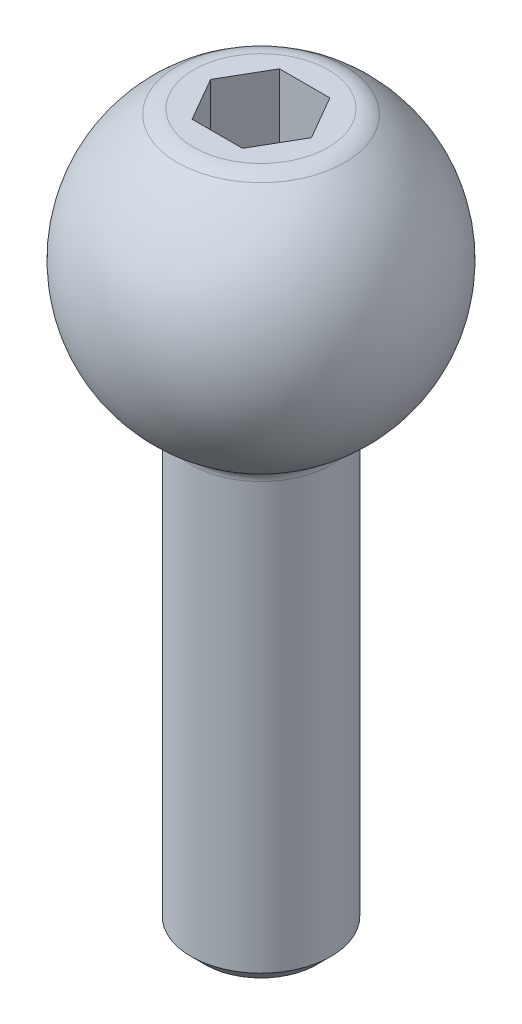
ISO-10303-21;
HEADER;
FILE_DESCRIPTION(('STEP AP214'),'2;1');
FILE_NAME('part.step','',(''),(''),'','','');
FILE_SCHEMA(('AUTOMOTIVE_DESIGN { 1 0 10303 214 1 1 1 1 }'));
ENDSEC;
DATA;
#1=APPLICATION_CONTEXT('core data for automotive mechanical design processes');
#2=APPLICATION_PROTOCOL_DEFINITION('international standard','automotive_design',2000,#1);
#3=PRODUCT_CONTEXT('',#1,'mechanical');
#4=PRODUCT('Part','Part','',(#3));
#5=PRODUCT_RELATED_PRODUCT_CATEGORY('part','',(#4));
#6=PRODUCT_DEFINITION_FORMATION('','',#4);
#7=PRODUCT_DEFINITION_CONTEXT('part definition',#1,'design');
#8=PRODUCT_DEFINITION('design','',#6,#7);
#9=PRODUCT_DEFINITION_SHAPE('','',#8);
#10=(LENGTH_UNIT() NAMED_UNIT(*) SI_UNIT(.MILLI.,.METRE.));
#11=(NAMED_UNIT(*) PLANE_ANGLE_UNIT() SI_UNIT($,.RADIAN.));
#12=(NAMED_UNIT(*) SI_UNIT($,.STERADIAN.) SOLID_ANGLE_UNIT());
#13=UNCERTAINTY_MEASURE_WITH_UNIT(LENGTH_MEASURE(1.E-05),#10,'distance_accuracy_value','');
#14=(GEOMETRIC_REPRESENTATION_CONTEXT(3) GLOBAL_UNCERTAINTY_ASSIGNED_CONTEXT((#13)) GLOBAL_UNIT_ASSIGNED_CONTEXT((#10,
#11,#12)) REPRESENTATION_CONTEXT('',''));
#15=CARTESIAN_POINT('',(0.,0.,0.));
#16=DIRECTION('',(0.,0.,1.));
#17=DIRECTION('',(1.,0.,0.));
#18=AXIS2_PLACEMENT_3D('',#15,#16,#17);
#19=CARTESIAN_POINT('',(0.,0.,0.));
#20=DIRECTION('',(0.,-1.,0.));
#21=DIRECTION('',(-1.,0.,0.));
#22=AXIS2_PLACEMENT_3D('',#19,#20,#21);
#23=SPHERICAL_SURFACE('',#22,4.1275);
#24=CARTESIAN_POINT('',(0.,3.43892318999651,0.));
#25=DIRECTION('',(0.,-1.,0.));
#26=DIRECTION('',(0.,0.,-1.));
#27=AXIS2_PLACEMENT_3D('',#24,#25,#26);
#28=CIRCLE('',#27,2.28255636147375);
#29=CARTESIAN_POINT('',(-2.28255636147374,3.43892318999651,0.));
#30=VERTEX_POINT('',#29);
#31=EDGE_CURVE('E12',#30,#30,#28,.T.);
#32=CARTESIAN_POINT('',(0.,-3.55757974853397,0.));
#33=DIRECTION('',(0.,1.,0.));
#34=DIRECTION('',(-1.,0.,0.));
#35=AXIS2_PLACEMENT_3D('',#32,#33,#34);
#36=CIRCLE('',#35,2.09281690140848);
#37=CARTESIAN_POINT('',(-2.09281690140847,-3.55757974853397,0.));
#38=VERTEX_POINT('',#37);
#39=EDGE_CURVE('E153',#38,#38,#36,.T.);
#40=CARTESIAN_POINT('',(-2.28255636147374,3.43892318999651,0.));
#41=CARTESIAN_POINT('',(-2.35505798357408,3.39080558247677,0.));
#42=CARTESIAN_POINT('',(-2.4260332394035,3.34038911810698,0.));
#43=CARTESIAN_POINT('',(-2.56465769851458,3.23517389673687,0.));
#44=CARTESIAN_POINT('',(-2.63230690179625,3.18037513973656,0.));
#45=CARTESIAN_POINT('',(-2.7640059358059,3.06661075417502,0.));
#46=CARTESIAN_POINT('',(-2.82805576653389,3.00764512561378,0.));
#47=CARTESIAN_POINT('',(-2.95230069197059,2.88578377551208,0.));
#48=CARTESIAN_POINT('',(-3.01249578667929,2.82288805397161,0.));
#49=CARTESIAN_POINT('',(-3.12879033568443,2.6934177536557,0.));
#50=CARTESIAN_POINT('',(-3.18488978998085,2.62684317488026,0.));
#51=CARTESIAN_POINT('',(-3.29276878690032,2.49028144362942,0.));
#52=CARTESIAN_POINT('',(-3.34454832952335,2.42029429115402,0.));
#53=CARTESIAN_POINT('',(-3.4435804373418,2.27718725159393,0.));
#54=CARTESIAN_POINT('',(-3.49083300253722,2.20406736450925,0.));
#55=CARTESIAN_POINT('',(-3.58062221017666,2.05498724591567,0.));
#56=CARTESIAN_POINT('',(-3.6231588526207,1.97902701440679,0.));
#57=CARTESIAN_POINT('',(-3.70334612210896,1.82456994837222,0.));
#58=CARTESIAN_POINT('',(-3.74099674915318,1.74607311384653,0.));
#59=CARTESIAN_POINT('',(-3.8112614342607,1.58685672805804,0.));
#60=CARTESIAN_POINT('',(-3.84387549232399,1.50613717679523,0.));
#61=CARTESIAN_POINT('',(-3.90393662530327,1.34279813134152,0.));
#62=CARTESIAN_POINT('',(-3.93138370021926,1.26017863715062,0.));
#63=CARTESIAN_POINT('',(-3.98100111408863,1.0933700770913,0.));
#64=CARTESIAN_POINT('',(-4.00317145304201,1.0091810112229,0.));
#65=CARTESIAN_POINT('',(-4.04214674227123,0.839569955284405,0.));
#66=CARTESIAN_POINT('',(-4.05895169254708,0.754147965214321,0.));
#67=CARTESIAN_POINT('',(-4.08712900633524,0.582412638461008,0.));
#68=CARTESIAN_POINT('',(-4.09850136984755,0.496099301777781,0.));
#69=CARTESIAN_POINT('',(-4.1157680353484,0.32292642361906,0.));
#70=CARTESIAN_POINT('',(-4.12166233733695,0.236066882143567,0.));
#71=CARTESIAN_POINT('',(-4.12794931019846,0.0621489203352528,0.));
#72=CARTESIAN_POINT('',(-4.12834198107142,-0.0249094999975685,0.));
#73=CARTESIAN_POINT('',(-4.1236241215256,-0.198877098327304,0.));
#74=CARTESIAN_POINT('',(-4.11851359110681,-0.285786276324219,0.));
#75=CARTESIAN_POINT('',(-4.10280976449589,-0.459107865565415,0.));
#76=CARTESIAN_POINT('',(-4.09221646830376,-0.545520276809696,0.));
#77=CARTESIAN_POINT('',(-4.06558946964324,-0.717502794553873,0.));
#78=CARTESIAN_POINT('',(-4.04955576717485,-0.803072901053768,0.));
#79=CARTESIAN_POINT('',(-4.01211207005491,-0.97302863944872,0.));
#80=CARTESIAN_POINT('',(-3.99070207540336,-1.05741427134378,0.));
#81=CARTESIAN_POINT('',(-3.94259140623056,-1.22466362703407,0.));
#82=CARTESIAN_POINT('',(-3.91589073170931,-1.3075273508293,0.));
#83=CARTESIAN_POINT('',(-3.85730547100025,-1.47140154250022,0.));
#84=CARTESIAN_POINT('',(-3.82542088481244,-1.5524120103759,0.));
#85=CARTESIAN_POINT('',(-3.75659529789844,-1.71225575298232,0.));
#86=CARTESIAN_POINT('',(-3.71965429717224,-1.79108902771305,0.));
#87=CARTESIAN_POINT('',(-3.64086359752218,-1.94626315289333,0.));
#88=CARTESIAN_POINT('',(-3.59901389859832,-2.02260400334286,0.));
#89=CARTESIAN_POINT('',(-3.51057314701628,-2.17248801481706,0.));
#90=CARTESIAN_POINT('',(-3.46398209435811,-2.24603117584171,0.));
#91=CARTESIAN_POINT('',(-3.36624494028222,-2.39002573227195,0.));
#92=CARTESIAN_POINT('',(-3.31509883886451,-2.46047712767753,0.));
#93=CARTESIAN_POINT('',(-3.20845610199029,-2.5980064330004,0.));
#94=CARTESIAN_POINT('',(-3.15295946653378,-2.6650843429177,0.));
#95=CARTESIAN_POINT('',(-3.03783758984878,-2.7955984721417,0.));
#96=CARTESIAN_POINT('',(-2.9782123486203,-2.85903469144842,0.));
#97=CARTESIAN_POINT('',(-2.85507163418516,-2.98201170247325,0.));
#98=CARTESIAN_POINT('',(-2.7915561609785,-3.04155249419137,0.));
#99=CARTESIAN_POINT('',(-2.66088914949714,-3.15650084022519,0.));
#100=CARTESIAN_POINT('',(-2.59373761122244,-3.21190839454089,0.));
#101=CARTESIAN_POINT('',(-2.45606629077885,-3.31836767552939,0.));
#102=CARTESIAN_POINT('',(-2.38554650860995,-3.3694194022022,0.));
#103=CARTESIAN_POINT('',(-2.24142329415391,-3.46696673700259,0.));
#104=CARTESIAN_POINT('',(-2.16781986186677,-3.51346234513017,0.));
#105=CARTESIAN_POINT('',(-2.09281690140847,-3.55757974853397,0.));
#106=B_SPLINE_CURVE_WITH_KNOTS('',3,(#40,#41,#42,#43,#44,#45,#46,#47,#48,#49,#50,#51,#52,#53,
#54,#55,#56,#57,#58,#59,#60,#61,#62,#63,#64,#65,#66,#67,#68,#69,#70,#71,#72,#73,#74,#75,#76,#77,
#78,#79,#80,#81,#82,#83,#84,#85,#86,#87,#88,#89,#90,#91,#92,#93,#94,#95,#96,#97,#98,#99,#100,
#101,#102,#103,#104,#105),.UNSPECIFIED.,.F.,.F.,(4,2,2,2,2,2,2,2,2,2,2,2,2,2,2,2,2,2,2,2,2,2,2,
2,2,2,2,2,2,2,2,2,4),(0.,0.261003855289274,0.522007710578546,0.78301156586782,1.04401542115709,
1.30501927644637,1.56602313173564,1.82702698702491,2.08803084231419,2.34903469760346,
2.61003855289273,2.87104240818201,3.13204626347128,3.39305011876056,3.65405397404983,
3.9150578293391,4.17606168462838,4.43706553991765,4.69806939520692,4.9590732504962,
5.22007710578547,5.48108096107474,5.74208481636402,6.00308867165329,6.26409252694256,
6.52509638223184,6.78610023752111,7.04710409281038,7.30810794809966,7.56911180338893,
7.83011565867821,8.09111951396748,8.35212336925675),.UNSPECIFIED.);
#107=EDGE_CURVE('BSEAM43',#30,#38,#106,.T.);
#108=ORIENTED_EDGE('',*,*,#31,.T.);
#109=ORIENTED_EDGE('',*,*,#39,.T.);
#110=ORIENTED_EDGE('',*,*,#107,.T.);
#111=ORIENTED_EDGE('',*,*,#107,.F.);
#112=EDGE_LOOP('',(#108,#110,#109,#111));
#113=FACE_BOUND('',#112,.T.);
#114=ADVANCED_FACE('F43',(#113),#23,.T.);
#115=CARTESIAN_POINT('',(3.4828776957276E-13,-101.534252961197,0.));
#116=DIRECTION('',(0.,-1.,0.));
#117=DIRECTION('',(1.,0.,0.));
#118=AXIS2_PLACEMENT_3D('',#115,#116,#117);
#119=CYLINDRICAL_SURFACE('',#118,1.90500000000003);
#120=CARTESIAN_POINT('',(0.,-15.494,0.));
#121=DIRECTION('',(0.,1.,0.));
#122=DIRECTION('',(-1.,0.,0.));
#123=AXIS2_PLACEMENT_3D('',#120,#121,#122);
#124=CIRCLE('',#123,1.90500000000003);
#125=CARTESIAN_POINT('',(-1.90499999999998,-15.494,0.));
#126=VERTEX_POINT('',#125);
#127=EDGE_CURVE('E159',#126,#126,#124,.T.);
#128=ORIENTED_EDGE('',*,*,#127,.T.);
#129=EDGE_LOOP('',(#128));
#130=FACE_BOUND('',#129,.T.);
#131=CARTESIAN_POINT('',(0.,-3.88597172532171,0.));
#132=DIRECTION('',(0.,1.,0.));
#133=DIRECTION('',(-1.,0.,0.));
#134=AXIS2_PLACEMENT_3D('',#131,#132,#133);
#135=CIRCLE('',#134,1.90500000000003);
#136=CARTESIAN_POINT('',(-1.90500000000002,-3.88597172532171,0.));
#137=VERTEX_POINT('',#136);
#138=EDGE_CURVE('E145',#137,#137,#135,.F.);
#139=ORIENTED_EDGE('',*,*,#138,.T.);
#140=EDGE_LOOP('',(#139));
#141=FACE_BOUND('',#140,.T.);
#142=ADVANCED_FACE('F180',(#130,#141),#119,.T.);
#143=CARTESIAN_POINT('',(-1.905,-15.875,0.));
#144=DIRECTION('',(0.,1.,0.));
#145=DIRECTION('',(-1.,0.,0.));
#146=AXIS2_PLACEMENT_3D('',#143,#144,#145);
#147=PLANE('',#146);
#148=CARTESIAN_POINT('',(0.,-15.875,0.));
#149=DIRECTION('',(0.,1.,0.));
#150=DIRECTION('',(-1.,0.,0.));
#151=AXIS2_PLACEMENT_3D('',#148,#149,#150);
#152=CIRCLE('',#151,1.52400000000007);
#153=CARTESIAN_POINT('',(-1.52400000000001,-15.875,0.));
#154=VERTEX_POINT('',#153);
#155=EDGE_CURVE('E156',#154,#154,#152,.F.);
#156=ORIENTED_EDGE('',*,*,#155,.T.);
#157=EDGE_LOOP('',(#156));
#158=FACE_BOUND('',#157,.T.);
#159=ADVANCED_FACE('F186',(#158),#147,.F.);
#160=CARTESIAN_POINT('',(0.,-3.88597172532172,0.));
#161=DIRECTION('',(0.,1.,0.));
#162=DIRECTION('',(-1.,0.,0.));
#163=AXIS2_PLACEMENT_3D('',#160,#161,#162);
#164=TOROIDAL_SURFACE('',#163,2.28600000000003,0.381);
#165=ORIENTED_EDGE('',*,*,#39,.F.);
#166=EDGE_LOOP('',(#165));
#167=FACE_BOUND('',#166,.T.);
#168=ORIENTED_EDGE('',*,*,#138,.F.);
#169=EDGE_LOOP('',(#168));
#170=FACE_BOUND('',#169,.T.);
#171=ADVANCED_FACE('F192',(#167,#170),#164,.F.);
#172=CARTESIAN_POINT('',(0.,-15.875,0.));
#173=DIRECTION('',(0.,1.,0.));
#174=DIRECTION('',(-1.,0.,0.));
#175=AXIS2_PLACEMENT_3D('',#172,#173,#174);
#176=CONICAL_SURFACE('',#175,1.52400000000007,0.785398163397452);
#177=ORIENTED_EDGE('',*,*,#127,.F.);
#178=EDGE_LOOP('',(#177));
#179=FACE_BOUND('',#178,.T.);
#180=ORIENTED_EDGE('',*,*,#155,.F.);
#181=EDGE_LOOP('',(#180));
#182=FACE_BOUND('',#181,.T.);
#183=ADVANCED_FACE('F175',(#179,#182),#176,.T.);
#184=CARTESIAN_POINT('',(0.,3.57451985412027,0.));
#185=DIRECTION('',(0.,1.,0.));
#186=DIRECTION('',(0.,0.,1.));
#187=AXIS2_PLACEMENT_3D('',#184,#185,#186);
#188=PLANE('',#187);
#189=DIRECTION('',(0.5,0.,0.866025403784439));
#190=VECTOR('',#189,1.);
#191=CARTESIAN_POINT('',(-1.3748153285078,3.57451985412027,0.));
#192=LINE('',#191,#190);
#193=CARTESIAN_POINT('',(-1.3748153285078,3.57451985412027,0.));
#194=VERTEX_POINT('',#193);
#195=CARTESIAN_POINT('',(-0.687407664253897,3.57451985412027,1.190625));
#196=VERTEX_POINT('',#195);
#197=EDGE_CURVE('E58',#194,#196,#192,.T.);
#198=ORIENTED_EDGE('',*,*,#197,.F.);
#199=DIRECTION('',(-0.5,0.,0.866025403784438));
#200=VECTOR('',#199,1.);
#201=CARTESIAN_POINT('',(-0.687407664253897,3.57451985412027,-1.190625));
#202=LINE('',#201,#200);
#203=CARTESIAN_POINT('',(-0.687407664253897,3.57451985412027,-1.190625));
#204=VERTEX_POINT('',#203);
#205=EDGE_CURVE('E141',#204,#194,#202,.T.);
#206=ORIENTED_EDGE('',*,*,#205,.F.);
#207=DIRECTION('',(-1.,0.,0.));
#208=VECTOR('',#207,1.);
#209=CARTESIAN_POINT('',(0.687407664253899,3.57451985412027,-1.190625));
#210=LINE('',#209,#208);
#211=CARTESIAN_POINT('',(0.687407664253899,3.57451985412027,-1.190625));
#212=VERTEX_POINT('',#211);
#213=EDGE_CURVE('E139',#212,#204,#210,.T.);
#214=ORIENTED_EDGE('',*,*,#213,.F.);
#215=DIRECTION('',(-0.5,0.,-0.866025403784438));
#216=VECTOR('',#215,1.);
#217=CARTESIAN_POINT('',(1.3748153285078,3.57451985412027,0.));
#218=LINE('',#217,#216);
#219=CARTESIAN_POINT('',(1.3748153285078,3.57451985412027,0.));
#220=VERTEX_POINT('',#219);
#221=EDGE_CURVE('E106',#220,#212,#218,.T.);
#222=ORIENTED_EDGE('',*,*,#221,.F.);
#223=DIRECTION('',(0.5,0.,-0.866025403784439));
#224=VECTOR('',#223,1.);
#225=CARTESIAN_POINT('',(0.687407664253899,3.57451985412027,1.190625));
#226=LINE('',#225,#224);
#227=CARTESIAN_POINT('',(0.687407664253899,3.57451985412027,1.190625));
#228=VERTEX_POINT('',#227);
#229=EDGE_CURVE('E135',#228,#220,#226,.T.);
#230=ORIENTED_EDGE('',*,*,#229,.F.);
#231=DIRECTION('',(1.,0.,0.));
#232=VECTOR('',#231,1.);
#233=CARTESIAN_POINT('',(-0.687407664253897,3.57451985412027,1.190625));
#234=LINE('',#233,#232);
#235=EDGE_CURVE('E132',#196,#228,#234,.T.);
#236=ORIENTED_EDGE('',*,*,#235,.F.);
#237=EDGE_LOOP('',(#198,#206,#214,#222,#230,#236));
#238=FACE_BOUND('',#237,.T.);
#239=CARTESIAN_POINT('',(0.,3.57451985412027,0.));
#240=DIRECTION('',(0.,1.,0.));
#241=DIRECTION('',(0.,0.,1.));
#242=AXIS2_PLACEMENT_3D('',#239,#240,#241);
#243=CIRCLE('',#242,1.83306833952199);
#244=CARTESIAN_POINT('',(0.,3.57451985412027,1.83306833952199));
#245=VERTEX_POINT('',#244);
#246=EDGE_CURVE('E51',#245,#245,#243,.T.);
#247=ORIENTED_EDGE('',*,*,#246,.T.);
#248=EDGE_LOOP('',(#247));
#249=FACE_BOUND('',#248,.T.);
#250=ADVANCED_FACE('F164',(#238,#249),#188,.T.);
#251=CARTESIAN_POINT('',(0.,2.76171985412027,0.));
#252=DIRECTION('',(0.,1.,0.));
#253=DIRECTION('',(0.,0.,1.));
#254=AXIS2_PLACEMENT_3D('',#251,#252,#253);
#255=TOROIDAL_SURFACE('',#254,1.83306833952199,0.8128);
#256=ORIENTED_EDGE('',*,*,#31,.F.);
#257=EDGE_LOOP('',(#256));
#258=FACE_BOUND('',#257,.T.);
#259=ORIENTED_EDGE('',*,*,#246,.F.);
#260=EDGE_LOOP('',(#259));
#261=FACE_BOUND('',#260,.T.);
#262=ADVANCED_FACE('F45',(#258,#261),#255,.T.);
#263=CARTESIAN_POINT('',(-1.3748153285078,1.03451985412027,0.));
#264=DIRECTION('',(-0.866025403784439,0.,0.5));
#265=DIRECTION('',(0.5,0.,0.866025403784439));
#266=AXIS2_PLACEMENT_3D('',#263,#264,#265);
#267=PLANE('',#266);
#268=ORIENTED_EDGE('',*,*,#197,.T.);
#269=DIRECTION('',(0.,1.,0.));
#270=VECTOR('',#269,1.);
#271=CARTESIAN_POINT('',(-0.687407664253897,1.03451985412027,1.190625));
#272=LINE('',#271,#270);
#273=CARTESIAN_POINT('',(-0.687407664253897,1.03451985412027,1.190625));
#274=VERTEX_POINT('',#273);
#275=EDGE_CURVE('E88',#274,#196,#272,.T.);
#276=ORIENTED_EDGE('',*,*,#275,.F.);
#277=DIRECTION('',(0.5,0.,0.866025403784439));
#278=VECTOR('',#277,1.);
#279=CARTESIAN_POINT('',(-1.3748153285078,1.03451985412027,0.));
#280=LINE('',#279,#278);
#281=CARTESIAN_POINT('',(-1.3748153285078,1.03451985412027,0.));
#282=VERTEX_POINT('',#281);
#283=EDGE_CURVE('E143',#282,#274,#280,.T.);
#284=ORIENTED_EDGE('',*,*,#283,.F.);
#285=DIRECTION('',(0.,1.,0.));
#286=VECTOR('',#285,1.);
#287=CARTESIAN_POINT('',(-1.3748153285078,1.03451985412027,0.));
#288=LINE('',#287,#286);
#289=EDGE_CURVE('E66',#282,#194,#288,.T.);
#290=ORIENTED_EDGE('',*,*,#289,.T.);
#291=EDGE_LOOP('',(#268,#276,#284,#290));
#292=FACE_BOUND('',#291,.T.);
#293=ADVANCED_FACE('F167',(#292),#267,.F.);
#294=CARTESIAN_POINT('',(-0.687407664253897,1.03451985412027,-1.190625));
#295=DIRECTION('',(-0.866025403784438,0.,-0.5));
#296=DIRECTION('',(-0.5,0.,0.866025403784438));
#297=AXIS2_PLACEMENT_3D('',#294,#295,#296);
#298=PLANE('',#297);
#299=ORIENTED_EDGE('',*,*,#205,.T.);
#300=ORIENTED_EDGE('',*,*,#289,.F.);
#301=DIRECTION('',(-0.5,0.,0.866025403784438));
#302=VECTOR('',#301,1.);
#303=CARTESIAN_POINT('',(-0.687407664253897,1.03451985412027,-1.190625));
#304=LINE('',#303,#302);
#305=CARTESIAN_POINT('',(-0.687407664253897,1.03451985412027,-1.190625));
#306=VERTEX_POINT('',#305);
#307=EDGE_CURVE('E118',#306,#282,#304,.T.);
#308=ORIENTED_EDGE('',*,*,#307,.F.);
#309=DIRECTION('',(0.,1.,0.));
#310=VECTOR('',#309,1.);
#311=CARTESIAN_POINT('',(-0.687407664253897,1.03451985412027,-1.190625));
#312=LINE('',#311,#310);
#313=EDGE_CURVE('E110',#306,#204,#312,.T.);
#314=ORIENTED_EDGE('',*,*,#313,.T.);
#315=EDGE_LOOP('',(#299,#300,#308,#314));
#316=FACE_BOUND('',#315,.T.);
#317=ADVANCED_FACE('F173',(#316),#298,.F.);
#318=CARTESIAN_POINT('',(0.687407664253899,1.03451985412027,-1.190625));
#319=DIRECTION('',(0.,0.,-1.));
#320=DIRECTION('',(-1.,0.,0.));
#321=AXIS2_PLACEMENT_3D('',#318,#319,#320);
#322=PLANE('',#321);
#323=ORIENTED_EDGE('',*,*,#213,.T.);
#324=ORIENTED_EDGE('',*,*,#313,.F.);
#325=DIRECTION('',(-1.,0.,0.));
#326=VECTOR('',#325,1.);
#327=CARTESIAN_POINT('',(0.687407664253899,1.03451985412027,-1.190625));
#328=LINE('',#327,#326);
#329=CARTESIAN_POINT('',(0.687407664253899,1.03451985412027,-1.190625));
#330=VERTEX_POINT('',#329);
#331=EDGE_CURVE('E114',#330,#306,#328,.T.);
#332=ORIENTED_EDGE('',*,*,#331,.F.);
#333=DIRECTION('',(0.,1.,0.));
#334=VECTOR('',#333,1.);
#335=CARTESIAN_POINT('',(0.687407664253899,1.03451985412027,-1.190625));
#336=LINE('',#335,#334);
#337=EDGE_CURVE('E99',#330,#212,#336,.T.);
#338=ORIENTED_EDGE('',*,*,#337,.T.);
#339=EDGE_LOOP('',(#323,#324,#332,#338));
#340=FACE_BOUND('',#339,.T.);
#341=ADVANCED_FACE('F115',(#340),#322,.F.);
#342=CARTESIAN_POINT('',(1.3748153285078,1.03451985412027,0.));
#343=DIRECTION('',(0.866025403784438,0.,-0.5));
#344=DIRECTION('',(-0.5,0.,-0.866025403784439));
#345=AXIS2_PLACEMENT_3D('',#342,#343,#344);
#346=PLANE('',#345);
#347=ORIENTED_EDGE('',*,*,#221,.T.);
#348=ORIENTED_EDGE('',*,*,#337,.F.);
#349=DIRECTION('',(-0.5,0.,-0.866025403784438));
#350=VECTOR('',#349,1.);
#351=CARTESIAN_POINT('',(1.3748153285078,1.03451985412027,0.));
#352=LINE('',#351,#350);
#353=CARTESIAN_POINT('',(1.3748153285078,1.03451985412027,0.));
#354=VERTEX_POINT('',#353);
#355=EDGE_CURVE('E103',#354,#330,#352,.T.);
#356=ORIENTED_EDGE('',*,*,#355,.F.);
#357=DIRECTION('',(0.,1.,0.));
#358=VECTOR('',#357,1.);
#359=CARTESIAN_POINT('',(1.3748153285078,1.03451985412027,0.));
#360=LINE('',#359,#358);
#361=EDGE_CURVE('E111',#354,#220,#360,.T.);
#362=ORIENTED_EDGE('',*,*,#361,.T.);
#363=EDGE_LOOP('',(#347,#348,#356,#362));
#364=FACE_BOUND('',#363,.T.);
#365=ADVANCED_FACE('F101',(#364),#346,.F.);
#366=CARTESIAN_POINT('',(0.687407664253899,1.03451985412027,1.190625));
#367=DIRECTION('',(0.866025403784439,0.,0.5));
#368=DIRECTION('',(0.5,0.,-0.866025403784439));
#369=AXIS2_PLACEMENT_3D('',#366,#367,#368);
#370=PLANE('',#369);
#371=ORIENTED_EDGE('',*,*,#229,.T.);
#372=ORIENTED_EDGE('',*,*,#361,.F.);
#373=DIRECTION('',(0.5,0.,-0.866025403784439));
#374=VECTOR('',#373,1.);
#375=CARTESIAN_POINT('',(0.687407664253899,1.03451985412027,1.190625));
#376=LINE('',#375,#374);
#377=CARTESIAN_POINT('',(0.687407664253899,1.03451985412027,1.190625));
#378=VERTEX_POINT('',#377);
#379=EDGE_CURVE('E124',#378,#354,#376,.T.);
#380=ORIENTED_EDGE('',*,*,#379,.F.);
#381=DIRECTION('',(0.,1.,0.));
#382=VECTOR('',#381,1.);
#383=CARTESIAN_POINT('',(0.687407664253899,1.03451985412027,1.190625));
#384=LINE('',#383,#382);
#385=EDGE_CURVE('E148',#378,#228,#384,.T.);
#386=ORIENTED_EDGE('',*,*,#385,.T.);
#387=EDGE_LOOP('',(#371,#372,#380,#386));
#388=FACE_BOUND('',#387,.T.);
#389=ADVANCED_FACE('F213',(#388),#370,.F.);
#390=CARTESIAN_POINT('',(-0.687407664253897,1.03451985412027,1.190625));
#391=DIRECTION('',(0.,0.,1.));
#392=DIRECTION('',(1.,0.,0.));
#393=AXIS2_PLACEMENT_3D('',#390,#391,#392);
#394=PLANE('',#393);
#395=ORIENTED_EDGE('',*,*,#235,.T.);
#396=ORIENTED_EDGE('',*,*,#385,.F.);
#397=DIRECTION('',(1.,0.,0.));
#398=VECTOR('',#397,1.);
#399=CARTESIAN_POINT('',(-0.687407664253897,1.03451985412027,1.190625));
#400=LINE('',#399,#398);
#401=EDGE_CURVE('E126',#274,#378,#400,.T.);
#402=ORIENTED_EDGE('',*,*,#401,.F.);
#403=ORIENTED_EDGE('',*,*,#275,.T.);
#404=EDGE_LOOP('',(#395,#396,#402,#403));
#405=FACE_BOUND('',#404,.T.);
#406=ADVANCED_FACE('F210',(#405),#394,.F.);
#407=CARTESIAN_POINT('',(0.,1.03451985412027,0.));
#408=DIRECTION('',(0.,1.,0.));
#409=DIRECTION('',(0.,0.,1.));
#410=AXIS2_PLACEMENT_3D('',#407,#408,#409);
#411=PLANE('',#410);
#412=ORIENTED_EDGE('',*,*,#283,.T.);
#413=ORIENTED_EDGE('',*,*,#401,.T.);
#414=ORIENTED_EDGE('',*,*,#379,.T.);
#415=ORIENTED_EDGE('',*,*,#355,.T.);
#416=ORIENTED_EDGE('',*,*,#331,.T.);
#417=ORIENTED_EDGE('',*,*,#307,.T.);
#418=EDGE_LOOP('',(#412,#413,#414,#415,#416,#417));
#419=FACE_BOUND('',#418,.T.);
#420=ADVANCED_FACE('F121',(#419),#411,.T.);
#421=CLOSED_SHELL('',(#114,#142,#159,#171,#183,#250,#262,#293,#317,#341,#365,#389,#406,#420));
#422=MANIFOLD_SOLID_BREP('B2',#421);
#423=ADVANCED_BREP_SHAPE_REPRESENTATION('',(#18,#422),#14);
#424=SHAPE_DEFINITION_REPRESENTATION(#9,#423);
ENDSEC;
END-ISO-10303-21;
